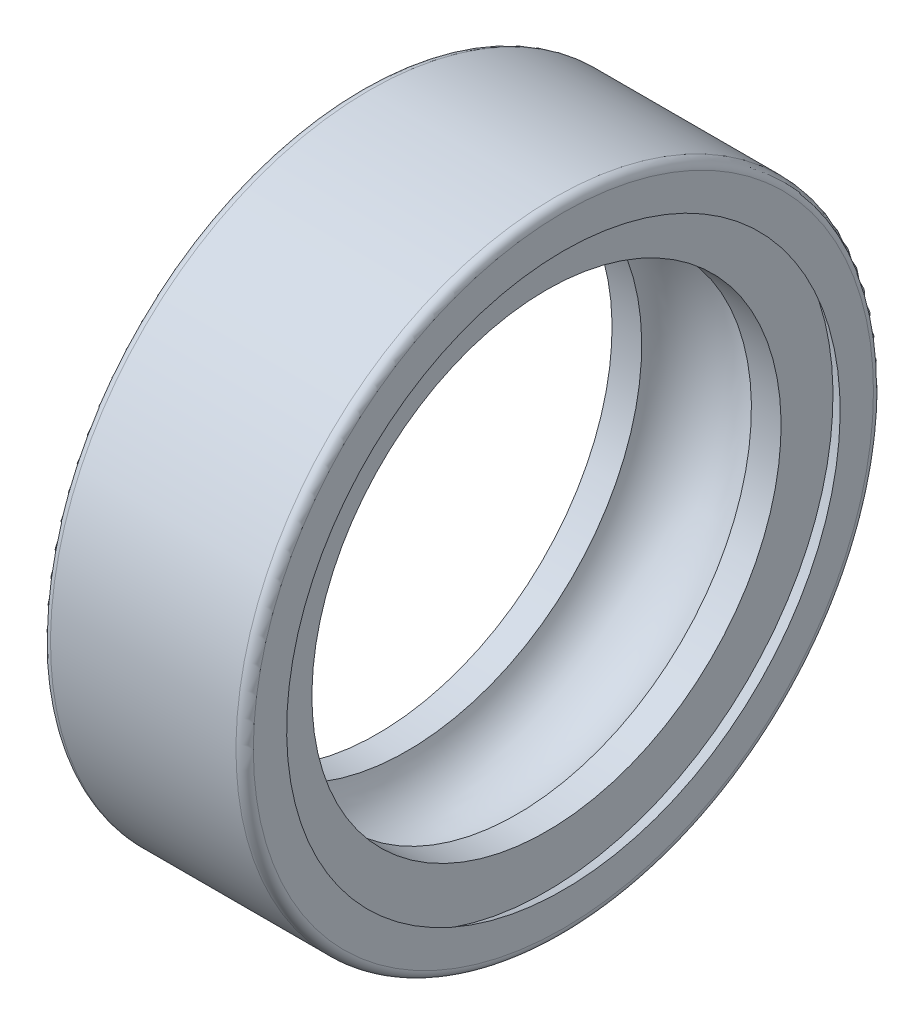
ISO-10303-21;
HEADER;
FILE_DESCRIPTION(('STEP AP214'),'2;1');
FILE_NAME('part.step','',(''),(''),'','','');
FILE_SCHEMA(('AUTOMOTIVE_DESIGN { 1 0 10303 214 1 1 1 1 }'));
ENDSEC;
DATA;
#1=APPLICATION_CONTEXT('core data for automotive mechanical design processes');
#2=APPLICATION_PROTOCOL_DEFINITION('international standard','automotive_design',2000,#1);
#3=PRODUCT_CONTEXT('',#1,'mechanical');
#4=PRODUCT('Part','Part','',(#3));
#5=PRODUCT_RELATED_PRODUCT_CATEGORY('part','',(#4));
#6=PRODUCT_DEFINITION_FORMATION('','',#4);
#7=PRODUCT_DEFINITION_CONTEXT('part definition',#1,'design');
#8=PRODUCT_DEFINITION('design','',#6,#7);
#9=PRODUCT_DEFINITION_SHAPE('','',#8);
#10=(LENGTH_UNIT() NAMED_UNIT(*) SI_UNIT(.MILLI.,.METRE.));
#11=(NAMED_UNIT(*) PLANE_ANGLE_UNIT() SI_UNIT($,.RADIAN.));
#12=(NAMED_UNIT(*) SI_UNIT($,.STERADIAN.) SOLID_ANGLE_UNIT());
#13=UNCERTAINTY_MEASURE_WITH_UNIT(LENGTH_MEASURE(1.E-05),#10,'distance_accuracy_value','');
#14=(GEOMETRIC_REPRESENTATION_CONTEXT(3) GLOBAL_UNCERTAINTY_ASSIGNED_CONTEXT((#13)) GLOBAL_UNIT_ASSIGNED_CONTEXT((#10,
#11,#12)) REPRESENTATION_CONTEXT('',''));
#15=CARTESIAN_POINT('',(0.,0.,0.));
#16=DIRECTION('',(0.,0.,1.));
#17=DIRECTION('',(1.,0.,0.));
#18=AXIS2_PLACEMENT_3D('',#15,#16,#17);
#19=CARTESIAN_POINT('',(6.41666666666667,8.99106882851363,0.));
#20=DIRECTION('',(1.,0.,0.));
#21=DIRECTION('',(0.,1.,0.));
#22=AXIS2_PLACEMENT_3D('',#19,#20,#21);
#23=PLANE('',#22);
#24=CARTESIAN_POINT('',(6.41666666666667,0.,0.));
#25=DIRECTION('',(1.,0.,0.));
#26=DIRECTION('',(0.,1.,0.));
#27=AXIS2_PLACEMENT_3D('',#24,#25,#26);
#28=CIRCLE('',#27,9.88678765702727);
#29=CARTESIAN_POINT('',(6.41666666666667,9.88678765702727,0.));
#30=VERTEX_POINT('',#29);
#31=EDGE_CURVE('E10',#30,#30,#28,.T.);
#32=ORIENTED_EDGE('',*,*,#31,.T.);
#33=EDGE_LOOP('',(#32));
#34=FACE_BOUND('',#33,.T.);
#35=CARTESIAN_POINT('',(6.41666666666667,0.,0.));
#36=DIRECTION('',(1.,0.,0.));
#37=DIRECTION('',(0.,1.,0.));
#38=AXIS2_PLACEMENT_3D('',#35,#36,#37);
#39=CIRCLE('',#38,8.09535);
#40=CARTESIAN_POINT('',(6.41666666666667,8.09535,0.));
#41=VERTEX_POINT('',#40);
#42=EDGE_CURVE('E86',#41,#41,#39,.T.);
#43=ORIENTED_EDGE('',*,*,#42,.F.);
#44=EDGE_LOOP('',(#43));
#45=FACE_BOUND('',#44,.T.);
#46=ADVANCED_FACE('F16',(#34,#45),#23,.T.);
#47=CARTESIAN_POINT('',(6.70833333333333,0.,0.));
#48=DIRECTION('',(-1.,0.,0.));
#49=DIRECTION('',(0.,1.,0.));
#50=AXIS2_PLACEMENT_3D('',#47,#48,#49);
#51=CONICAL_SURFACE('',#50,9.71839382851363,0.523598775598299);
#52=CARTESIAN_POINT('',(7.,0.,0.));
#53=DIRECTION('',(1.,0.,0.));
#54=DIRECTION('',(0.,1.,0.));
#55=AXIS2_PLACEMENT_3D('',#52,#53,#54);
#56=CIRCLE('',#55,9.55);
#57=CARTESIAN_POINT('',(7.,9.55,0.));
#58=VERTEX_POINT('',#57);
#59=EDGE_CURVE('E26',#58,#58,#56,.T.);
#60=ORIENTED_EDGE('',*,*,#59,.T.);
#61=EDGE_LOOP('',(#60));
#62=FACE_BOUND('',#61,.T.);
#63=ORIENTED_EDGE('',*,*,#31,.F.);
#64=EDGE_LOOP('',(#63));
#65=FACE_BOUND('',#64,.T.);
#66=ADVANCED_FACE('F18',(#62,#65),#51,.F.);
#67=CARTESIAN_POINT('',(7.,10.125,0.));
#68=DIRECTION('',(1.,0.,0.));
#69=DIRECTION('',(0.,1.,0.));
#70=AXIS2_PLACEMENT_3D('',#67,#68,#69);
#71=PLANE('',#70);
#72=CARTESIAN_POINT('',(7.,0.,0.));
#73=DIRECTION('',(1.,0.,0.));
#74=DIRECTION('',(0.,1.,0.));
#75=AXIS2_PLACEMENT_3D('',#72,#73,#74);
#76=CIRCLE('',#75,10.7);
#77=CARTESIAN_POINT('',(7.,10.7,0.));
#78=VERTEX_POINT('',#77);
#79=EDGE_CURVE('E68',#78,#78,#76,.T.);
#80=ORIENTED_EDGE('',*,*,#79,.T.);
#81=EDGE_LOOP('',(#80));
#82=FACE_BOUND('',#81,.T.);
#83=ORIENTED_EDGE('',*,*,#59,.F.);
#84=EDGE_LOOP('',(#83));
#85=FACE_BOUND('',#84,.T.);
#86=ADVANCED_FACE('F69',(#82,#85),#71,.T.);
#87=CARTESIAN_POINT('',(6.7,0.,0.));
#88=DIRECTION('',(1.,0.,0.));
#89=DIRECTION('',(0.,0.,-1.));
#90=AXIS2_PLACEMENT_3D('',#87,#88,#89);
#91=TOROIDAL_SURFACE('',#90,10.7,0.3);
#92=CARTESIAN_POINT('',(6.7,0.,0.));
#93=DIRECTION('',(1.,0.,0.));
#94=DIRECTION('',(0.,1.,0.));
#95=AXIS2_PLACEMENT_3D('',#92,#93,#94);
#96=CIRCLE('',#95,11.);
#97=CARTESIAN_POINT('',(6.7,11.,0.));
#98=VERTEX_POINT('',#97);
#99=EDGE_CURVE('E20',#98,#98,#96,.T.);
#100=ORIENTED_EDGE('',*,*,#99,.T.);
#101=EDGE_LOOP('',(#100));
#102=FACE_BOUND('',#101,.T.);
#103=ORIENTED_EDGE('',*,*,#79,.F.);
#104=EDGE_LOOP('',(#103));
#105=FACE_BOUND('',#104,.T.);
#106=ADVANCED_FACE('F141',(#102,#105),#91,.T.);
#107=CARTESIAN_POINT('',(3.5,0.,0.));
#108=DIRECTION('',(-1.,0.,0.));
#109=DIRECTION('',(0.,1.,0.));
#110=AXIS2_PLACEMENT_3D('',#107,#108,#109);
#111=CYLINDRICAL_SURFACE('',#110,11.);
#112=CARTESIAN_POINT('',(0.3,0.,0.));
#113=DIRECTION('',(1.,0.,0.));
#114=DIRECTION('',(0.,1.,0.));
#115=AXIS2_PLACEMENT_3D('',#112,#113,#114);
#116=CIRCLE('',#115,11.);
#117=CARTESIAN_POINT('',(0.3,11.,0.));
#118=VERTEX_POINT('',#117);
#119=EDGE_CURVE('E62',#118,#118,#116,.T.);
#120=ORIENTED_EDGE('',*,*,#119,.T.);
#121=EDGE_LOOP('',(#120));
#122=FACE_BOUND('',#121,.T.);
#123=ORIENTED_EDGE('',*,*,#99,.F.);
#124=EDGE_LOOP('',(#123));
#125=FACE_BOUND('',#124,.T.);
#126=ADVANCED_FACE('F136',(#122,#125),#111,.T.);
#127=CARTESIAN_POINT('',(0.3,0.,0.));
#128=DIRECTION('',(1.,0.,0.));
#129=DIRECTION('',(0.,0.,-1.));
#130=AXIS2_PLACEMENT_3D('',#127,#128,#129);
#131=TOROIDAL_SURFACE('',#130,10.7,0.3);
#132=CARTESIAN_POINT('',(0.,0.,0.));
#133=DIRECTION('',(1.,0.,0.));
#134=DIRECTION('',(0.,1.,0.));
#135=AXIS2_PLACEMENT_3D('',#132,#133,#134);
#136=CIRCLE('',#135,10.7);
#137=CARTESIAN_POINT('',(0.,10.7,0.));
#138=VERTEX_POINT('',#137);
#139=EDGE_CURVE('E56',#138,#138,#136,.T.);
#140=ORIENTED_EDGE('',*,*,#139,.T.);
#141=EDGE_LOOP('',(#140));
#142=FACE_BOUND('',#141,.T.);
#143=ORIENTED_EDGE('',*,*,#119,.F.);
#144=EDGE_LOOP('',(#143));
#145=FACE_BOUND('',#144,.T.);
#146=ADVANCED_FACE('F126',(#142,#145),#131,.T.);
#147=CARTESIAN_POINT('',(0.,10.125,0.));
#148=DIRECTION('',(-1.,0.,0.));
#149=DIRECTION('',(0.,-1.,0.));
#150=AXIS2_PLACEMENT_3D('',#147,#148,#149);
#151=PLANE('',#150);
#152=CARTESIAN_POINT('',(0.,0.,0.));
#153=DIRECTION('',(1.,0.,0.));
#154=DIRECTION('',(0.,1.,0.));
#155=AXIS2_PLACEMENT_3D('',#152,#153,#154);
#156=CIRCLE('',#155,9.55);
#157=CARTESIAN_POINT('',(0.,9.55,0.));
#158=VERTEX_POINT('',#157);
#159=EDGE_CURVE('E78',#158,#158,#156,.T.);
#160=ORIENTED_EDGE('',*,*,#159,.T.);
#161=EDGE_LOOP('',(#160));
#162=FACE_BOUND('',#161,.T.);
#163=ORIENTED_EDGE('',*,*,#139,.F.);
#164=EDGE_LOOP('',(#163));
#165=FACE_BOUND('',#164,.T.);
#166=ADVANCED_FACE('F116',(#162,#165),#151,.T.);
#167=CARTESIAN_POINT('',(0.291666666666667,0.,0.));
#168=DIRECTION('',(1.,0.,0.));
#169=DIRECTION('',(0.,1.,0.));
#170=AXIS2_PLACEMENT_3D('',#167,#168,#169);
#171=CONICAL_SURFACE('',#170,9.71839382851363,0.523598775598299);
#172=CARTESIAN_POINT('',(0.583333333333334,0.,0.));
#173=DIRECTION('',(1.,0.,0.));
#174=DIRECTION('',(0.,1.,0.));
#175=AXIS2_PLACEMENT_3D('',#172,#173,#174);
#176=CIRCLE('',#175,9.88678765702727);
#177=CARTESIAN_POINT('',(0.583333333333334,9.88678765702727,0.));
#178=VERTEX_POINT('',#177);
#179=EDGE_CURVE('E76',#178,#178,#176,.T.);
#180=ORIENTED_EDGE('',*,*,#179,.T.);
#181=EDGE_LOOP('',(#180));
#182=FACE_BOUND('',#181,.T.);
#183=ORIENTED_EDGE('',*,*,#159,.F.);
#184=EDGE_LOOP('',(#183));
#185=FACE_BOUND('',#184,.T.);
#186=ADVANCED_FACE('F118',(#182,#185),#171,.F.);
#187=CARTESIAN_POINT('',(0.583333333333333,8.99106882851364,0.));
#188=DIRECTION('',(-1.,0.,0.));
#189=DIRECTION('',(0.,-1.,0.));
#190=AXIS2_PLACEMENT_3D('',#187,#188,#189);
#191=PLANE('',#190);
#192=CARTESIAN_POINT('',(0.583333333333332,0.,0.));
#193=DIRECTION('',(1.,0.,0.));
#194=DIRECTION('',(0.,1.,0.));
#195=AXIS2_PLACEMENT_3D('',#192,#193,#194);
#196=CIRCLE('',#195,8.09535);
#197=CARTESIAN_POINT('',(0.583333333333333,8.09535,0.));
#198=VERTEX_POINT('',#197);
#199=EDGE_CURVE('E81',#198,#198,#196,.T.);
#200=ORIENTED_EDGE('',*,*,#199,.T.);
#201=EDGE_LOOP('',(#200));
#202=FACE_BOUND('',#201,.T.);
#203=ORIENTED_EDGE('',*,*,#179,.F.);
#204=EDGE_LOOP('',(#203));
#205=FACE_BOUND('',#204,.T.);
#206=ADVANCED_FACE('F106',(#202,#205),#191,.T.);
#207=CARTESIAN_POINT('',(1.0951204940607,0.,0.));
#208=DIRECTION('',(-1.,0.,0.));
#209=DIRECTION('',(0.,1.,0.));
#210=AXIS2_PLACEMENT_3D('',#207,#208,#209);
#211=CYLINDRICAL_SURFACE('',#210,8.09535);
#212=CARTESIAN_POINT('',(1.60690765478807,0.,0.));
#213=DIRECTION('',(1.,0.,0.));
#214=DIRECTION('',(0.,1.,0.));
#215=AXIS2_PLACEMENT_3D('',#212,#213,#214);
#216=CIRCLE('',#215,8.09535);
#217=CARTESIAN_POINT('',(1.60690765478807,8.09535,0.));
#218=VERTEX_POINT('',#217);
#219=EDGE_CURVE('E82',#218,#218,#216,.T.);
#220=ORIENTED_EDGE('',*,*,#219,.T.);
#221=EDGE_LOOP('',(#220));
#222=FACE_BOUND('',#221,.T.);
#223=ORIENTED_EDGE('',*,*,#199,.F.);
#224=EDGE_LOOP('',(#223));
#225=FACE_BOUND('',#224,.T.);
#226=ADVANCED_FACE('F92',(#222,#225),#211,.F.);
#227=CARTESIAN_POINT('',(3.5,0.,0.));
#228=DIRECTION('',(1.,0.,0.));
#229=DIRECTION('',(0.,0.,-1.));
#230=AXIS2_PLACEMENT_3D('',#227,#228,#229);
#231=TOROIDAL_SURFACE('',#230,7.5,1.9845);
#232=CARTESIAN_POINT('',(5.39309234521193,0.,0.));
#233=DIRECTION('',(1.,0.,0.));
#234=DIRECTION('',(0.,1.,0.));
#235=AXIS2_PLACEMENT_3D('',#232,#233,#234);
#236=CIRCLE('',#235,8.09535);
#237=CARTESIAN_POINT('',(5.39309234521193,8.09535,0.));
#238=VERTEX_POINT('',#237);
#239=EDGE_CURVE('E84',#238,#238,#236,.T.);
#240=ORIENTED_EDGE('',*,*,#239,.T.);
#241=EDGE_LOOP('',(#240));
#242=FACE_BOUND('',#241,.T.);
#243=ORIENTED_EDGE('',*,*,#219,.F.);
#244=EDGE_LOOP('',(#243));
#245=FACE_BOUND('',#244,.T.);
#246=ADVANCED_FACE('F95',(#242,#245),#231,.F.);
#247=CARTESIAN_POINT('',(5.9048795059393,0.,0.));
#248=DIRECTION('',(-1.,0.,0.));
#249=DIRECTION('',(0.,1.,0.));
#250=AXIS2_PLACEMENT_3D('',#247,#248,#249);
#251=CYLINDRICAL_SURFACE('',#250,8.09535);
#252=ORIENTED_EDGE('',*,*,#42,.T.);
#253=EDGE_LOOP('',(#252));
#254=FACE_BOUND('',#253,.T.);
#255=ORIENTED_EDGE('',*,*,#239,.F.);
#256=EDGE_LOOP('',(#255));
#257=FACE_BOUND('',#256,.T.);
#258=ADVANCED_FACE('F97',(#254,#257),#251,.F.);
#259=CLOSED_SHELL('',(#46,#66,#86,#106,#126,#146,#166,#186,#206,#226,#246,#258));
#260=MANIFOLD_SOLID_BREP('B1',#259);
#261=ADVANCED_BREP_SHAPE_REPRESENTATION('',(#18,#260),#14);
#262=SHAPE_DEFINITION_REPRESENTATION(#9,#261);
ENDSEC;
END-ISO-10303-21;
